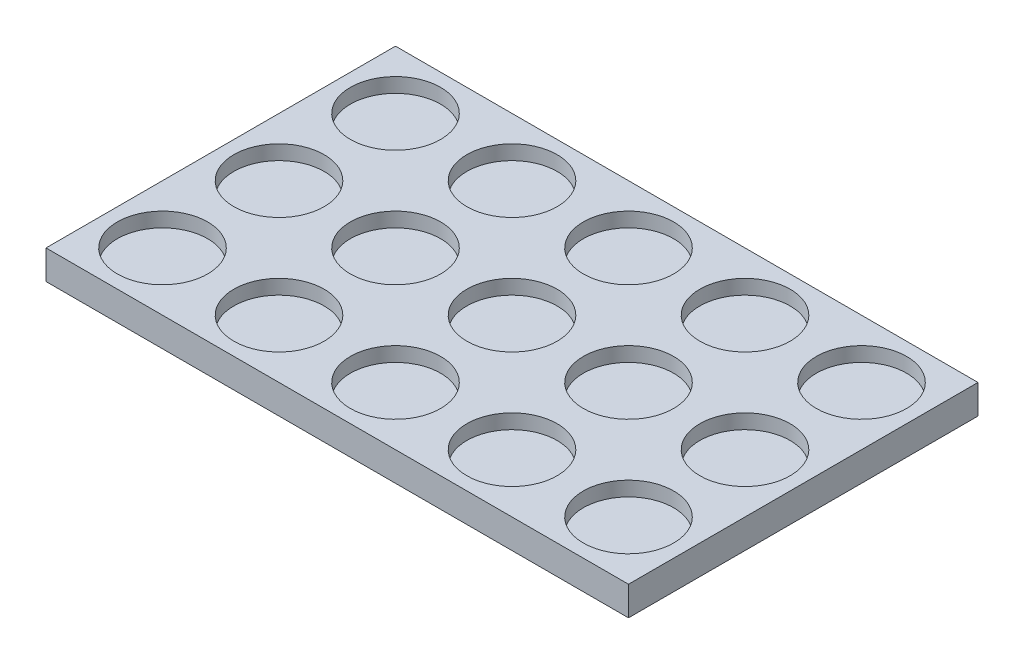
ISO-10303-21;
HEADER;
FILE_DESCRIPTION(('STEP AP214'),'2;1');
FILE_NAME('part.step','',(''),(''),'','','');
FILE_SCHEMA(('AUTOMOTIVE_DESIGN { 1 0 10303 214 1 1 1 1 }'));
ENDSEC;
DATA;
#1=APPLICATION_CONTEXT('core data for automotive mechanical design processes');
#2=APPLICATION_PROTOCOL_DEFINITION('international standard','automotive_design',2000,#1);
#3=PRODUCT_CONTEXT('',#1,'mechanical');
#4=PRODUCT('Part','Part','',(#3));
#5=PRODUCT_RELATED_PRODUCT_CATEGORY('part','',(#4));
#6=PRODUCT_DEFINITION_FORMATION('','',#4);
#7=PRODUCT_DEFINITION_CONTEXT('part definition',#1,'design');
#8=PRODUCT_DEFINITION('design','',#6,#7);
#9=PRODUCT_DEFINITION_SHAPE('','',#8);
#10=(LENGTH_UNIT() NAMED_UNIT(*) SI_UNIT(.MILLI.,.METRE.));
#11=(NAMED_UNIT(*) PLANE_ANGLE_UNIT() SI_UNIT($,.RADIAN.));
#12=(NAMED_UNIT(*) SI_UNIT($,.STERADIAN.) SOLID_ANGLE_UNIT());
#13=UNCERTAINTY_MEASURE_WITH_UNIT(LENGTH_MEASURE(1.E-05),#10,'distance_accuracy_value','');
#14=(GEOMETRIC_REPRESENTATION_CONTEXT(3) GLOBAL_UNCERTAINTY_ASSIGNED_CONTEXT((#13)) GLOBAL_UNIT_ASSIGNED_CONTEXT((#10,
#11,#12)) REPRESENTATION_CONTEXT('',''));
#15=CARTESIAN_POINT('',(0.,0.,0.));
#16=DIRECTION('',(0.,0.,1.));
#17=DIRECTION('',(1.,0.,0.));
#18=AXIS2_PLACEMENT_3D('',#15,#16,#17);
#19=CARTESIAN_POINT('',(-254.,25.4,-152.4));
#20=DIRECTION('',(1.,0.,0.));
#21=DIRECTION('',(0.,0.,-1.));
#22=AXIS2_PLACEMENT_3D('',#19,#20,#21);
#23=PLANE('',#22);
#24=DIRECTION('',(0.,0.,1.));
#25=VECTOR('',#24,1.);
#26=CARTESIAN_POINT('',(-254.,0.,-152.4));
#27=LINE('',#26,#25);
#28=CARTESIAN_POINT('',(-254.,0.,-152.4));
#29=VERTEX_POINT('',#28);
#30=CARTESIAN_POINT('',(-254.,0.,152.4));
#31=VERTEX_POINT('',#30);
#32=EDGE_CURVE('E101',#29,#31,#27,.T.);
#33=ORIENTED_EDGE('',*,*,#32,.T.);
#34=DIRECTION('',(0.,-1.,0.));
#35=VECTOR('',#34,1.);
#36=CARTESIAN_POINT('',(-254.,25.4,152.4));
#37=LINE('',#36,#35);
#38=CARTESIAN_POINT('',(-254.,25.4,152.4));
#39=VERTEX_POINT('',#38);
#40=EDGE_CURVE('E92',#39,#31,#37,.T.);
#41=ORIENTED_EDGE('',*,*,#40,.F.);
#42=DIRECTION('',(0.,0.,1.));
#43=VECTOR('',#42,1.);
#44=CARTESIAN_POINT('',(-254.,25.4,-152.4));
#45=LINE('',#44,#43);
#46=CARTESIAN_POINT('',(-254.,25.4,-152.4));
#47=VERTEX_POINT('',#46);
#48=EDGE_CURVE('E86',#47,#39,#45,.T.);
#49=ORIENTED_EDGE('',*,*,#48,.F.);
#50=DIRECTION('',(0.,-1.,0.));
#51=VECTOR('',#50,1.);
#52=CARTESIAN_POINT('',(-254.,25.4,-152.4));
#53=LINE('',#52,#51);
#54=EDGE_CURVE('E97',#47,#29,#53,.T.);
#55=ORIENTED_EDGE('',*,*,#54,.T.);
#56=EDGE_LOOP('',(#33,#41,#49,#55));
#57=FACE_BOUND('',#56,.T.);
#58=ADVANCED_FACE('F32',(#57),#23,.F.);
#59=CARTESIAN_POINT('',(-254.,25.4,152.4));
#60=DIRECTION('',(0.,0.,-1.));
#61=DIRECTION('',(-1.,0.,0.));
#62=AXIS2_PLACEMENT_3D('',#59,#60,#61);
#63=PLANE('',#62);
#64=DIRECTION('',(1.,0.,0.));
#65=VECTOR('',#64,1.);
#66=CARTESIAN_POINT('',(-254.,0.,152.4));
#67=LINE('',#66,#65);
#68=CARTESIAN_POINT('',(254.,0.,152.4));
#69=VERTEX_POINT('',#68);
#70=EDGE_CURVE('E91',#31,#69,#67,.T.);
#71=ORIENTED_EDGE('',*,*,#70,.T.);
#72=DIRECTION('',(0.,-1.,0.));
#73=VECTOR('',#72,1.);
#74=CARTESIAN_POINT('',(254.,25.4,152.4));
#75=LINE('',#74,#73);
#76=CARTESIAN_POINT('',(254.,25.4,152.4));
#77=VERTEX_POINT('',#76);
#78=EDGE_CURVE('E89',#77,#69,#75,.T.);
#79=ORIENTED_EDGE('',*,*,#78,.F.);
#80=DIRECTION('',(1.,0.,0.));
#81=VECTOR('',#80,1.);
#82=CARTESIAN_POINT('',(-254.,25.4,152.4));
#83=LINE('',#82,#81);
#84=EDGE_CURVE('E80',#39,#77,#83,.T.);
#85=ORIENTED_EDGE('',*,*,#84,.F.);
#86=ORIENTED_EDGE('',*,*,#40,.T.);
#87=EDGE_LOOP('',(#71,#79,#85,#86));
#88=FACE_BOUND('',#87,.T.);
#89=ADVANCED_FACE('F90',(#88),#63,.F.);
#90=CARTESIAN_POINT('',(254.,25.4,-152.4));
#91=DIRECTION('',(-1.,0.,0.));
#92=DIRECTION('',(0.,0.,1.));
#93=AXIS2_PLACEMENT_3D('',#90,#91,#92);
#94=PLANE('',#93);
#95=DIRECTION('',(0.,0.,-1.));
#96=VECTOR('',#95,1.);
#97=CARTESIAN_POINT('',(254.,0.,-152.4));
#98=LINE('',#97,#96);
#99=CARTESIAN_POINT('',(254.,0.,-152.4));
#100=VERTEX_POINT('',#99);
#101=EDGE_CURVE('E66',#69,#100,#98,.T.);
#102=ORIENTED_EDGE('',*,*,#101,.T.);
#103=DIRECTION('',(0.,-1.,0.));
#104=VECTOR('',#103,1.);
#105=CARTESIAN_POINT('',(254.,25.4,-152.4));
#106=LINE('',#105,#104);
#107=CARTESIAN_POINT('',(254.,25.4,-152.4));
#108=VERTEX_POINT('',#107);
#109=EDGE_CURVE('E93',#108,#100,#106,.T.);
#110=ORIENTED_EDGE('',*,*,#109,.F.);
#111=DIRECTION('',(0.,0.,-1.));
#112=VECTOR('',#111,1.);
#113=CARTESIAN_POINT('',(254.,25.4,-152.4));
#114=LINE('',#113,#112);
#115=EDGE_CURVE('E84',#77,#108,#114,.T.);
#116=ORIENTED_EDGE('',*,*,#115,.F.);
#117=ORIENTED_EDGE('',*,*,#78,.T.);
#118=EDGE_LOOP('',(#102,#110,#116,#117));
#119=FACE_BOUND('',#118,.T.);
#120=ADVANCED_FACE('F95',(#119),#94,.F.);
#121=CARTESIAN_POINT('',(-254.,25.4,-152.4));
#122=DIRECTION('',(0.,0.,1.));
#123=DIRECTION('',(1.,0.,0.));
#124=AXIS2_PLACEMENT_3D('',#121,#122,#123);
#125=PLANE('',#124);
#126=DIRECTION('',(-1.,0.,0.));
#127=VECTOR('',#126,1.);
#128=CARTESIAN_POINT('',(-254.,0.,-152.4));
#129=LINE('',#128,#127);
#130=EDGE_CURVE('E72',#100,#29,#129,.T.);
#131=ORIENTED_EDGE('',*,*,#130,.T.);
#132=ORIENTED_EDGE('',*,*,#54,.F.);
#133=DIRECTION('',(-1.,0.,0.));
#134=VECTOR('',#133,1.);
#135=CARTESIAN_POINT('',(-254.,25.4,-152.4));
#136=LINE('',#135,#134);
#137=EDGE_CURVE('E49',#108,#47,#136,.T.);
#138=ORIENTED_EDGE('',*,*,#137,.F.);
#139=ORIENTED_EDGE('',*,*,#109,.T.);
#140=EDGE_LOOP('',(#131,#132,#138,#139));
#141=FACE_BOUND('',#140,.T.);
#142=ADVANCED_FACE('F189',(#141),#125,.F.);
#143=CARTESIAN_POINT('',(0.,25.4,0.));
#144=DIRECTION('',(0.,1.,0.));
#145=DIRECTION('',(0.,0.,1.));
#146=AXIS2_PLACEMENT_3D('',#143,#144,#145);
#147=PLANE('',#146);
#148=CARTESIAN_POINT('',(-101.6,25.4,101.6));
#149=DIRECTION('',(0.,1.,0.));
#150=DIRECTION('',(0.,0.,1.));
#151=AXIS2_PLACEMENT_3D('',#148,#149,#150);
#152=CIRCLE('',#151,39.37);
#153=CARTESIAN_POINT('',(-101.6,25.4,140.97));
#154=VERTEX_POINT('',#153);
#155=EDGE_CURVE('E549',#154,#154,#152,.T.);
#156=ORIENTED_EDGE('',*,*,#155,.F.);
#157=EDGE_LOOP('',(#156));
#158=FACE_BOUND('',#157,.T.);
#159=CARTESIAN_POINT('',(-203.2,25.4,101.6));
#160=DIRECTION('',(0.,1.,0.));
#161=DIRECTION('',(0.,0.,1.));
#162=AXIS2_PLACEMENT_3D('',#159,#160,#161);
#163=CIRCLE('',#162,39.37);
#164=CARTESIAN_POINT('',(-203.2,25.4,140.97));
#165=VERTEX_POINT('',#164);
#166=EDGE_CURVE('E544',#165,#165,#163,.T.);
#167=ORIENTED_EDGE('',*,*,#166,.F.);
#168=EDGE_LOOP('',(#167));
#169=FACE_BOUND('',#168,.T.);
#170=ORIENTED_EDGE('',*,*,#48,.T.);
#171=ORIENTED_EDGE('',*,*,#84,.T.);
#172=ORIENTED_EDGE('',*,*,#115,.T.);
#173=ORIENTED_EDGE('',*,*,#137,.T.);
#174=EDGE_LOOP('',(#170,#171,#172,#173));
#175=FACE_BOUND('',#174,.T.);
#176=CARTESIAN_POINT('',(0.,25.4,101.6));
#177=DIRECTION('',(0.,1.,0.));
#178=DIRECTION('',(0.,0.,1.));
#179=AXIS2_PLACEMENT_3D('',#176,#177,#178);
#180=CIRCLE('',#179,39.37);
#181=CARTESIAN_POINT('',(0.,25.4,140.97));
#182=VERTEX_POINT('',#181);
#183=EDGE_CURVE('E111',#182,#182,#180,.T.);
#184=ORIENTED_EDGE('',*,*,#183,.F.);
#185=EDGE_LOOP('',(#184));
#186=FACE_BOUND('',#185,.T.);
#187=CARTESIAN_POINT('',(101.6,25.4,101.6));
#188=DIRECTION('',(0.,1.,0.));
#189=DIRECTION('',(0.,0.,1.));
#190=AXIS2_PLACEMENT_3D('',#187,#188,#189);
#191=CIRCLE('',#190,39.37);
#192=CARTESIAN_POINT('',(101.6,25.4,140.97));
#193=VERTEX_POINT('',#192);
#194=EDGE_CURVE('E117',#193,#193,#191,.T.);
#195=ORIENTED_EDGE('',*,*,#194,.F.);
#196=EDGE_LOOP('',(#195));
#197=FACE_BOUND('',#196,.T.);
#198=CARTESIAN_POINT('',(203.2,25.4,101.6));
#199=DIRECTION('',(0.,1.,0.));
#200=DIRECTION('',(0.,0.,1.));
#201=AXIS2_PLACEMENT_3D('',#198,#199,#200);
#202=CIRCLE('',#201,39.37);
#203=CARTESIAN_POINT('',(203.2,25.4,140.97));
#204=VERTEX_POINT('',#203);
#205=EDGE_CURVE('E123',#204,#204,#202,.T.);
#206=ORIENTED_EDGE('',*,*,#205,.F.);
#207=EDGE_LOOP('',(#206));
#208=FACE_BOUND('',#207,.T.);
#209=CARTESIAN_POINT('',(-203.2,25.4,0.));
#210=DIRECTION('',(0.,1.,0.));
#211=DIRECTION('',(0.,0.,1.));
#212=AXIS2_PLACEMENT_3D('',#209,#210,#211);
#213=CIRCLE('',#212,39.37);
#214=CARTESIAN_POINT('',(-203.2,25.4,39.3700000000001));
#215=VERTEX_POINT('',#214);
#216=EDGE_CURVE('E129',#215,#215,#213,.T.);
#217=ORIENTED_EDGE('',*,*,#216,.F.);
#218=EDGE_LOOP('',(#217));
#219=FACE_BOUND('',#218,.T.);
#220=CARTESIAN_POINT('',(-101.6,25.4,0.));
#221=DIRECTION('',(0.,1.,0.));
#222=DIRECTION('',(0.,0.,1.));
#223=AXIS2_PLACEMENT_3D('',#220,#221,#222);
#224=CIRCLE('',#223,39.37);
#225=CARTESIAN_POINT('',(-101.6,25.4,39.3700000000001));
#226=VERTEX_POINT('',#225);
#227=EDGE_CURVE('E135',#226,#226,#224,.T.);
#228=ORIENTED_EDGE('',*,*,#227,.F.);
#229=EDGE_LOOP('',(#228));
#230=FACE_BOUND('',#229,.T.);
#231=CARTESIAN_POINT('',(0.,25.4,0.));
#232=DIRECTION('',(0.,1.,0.));
#233=DIRECTION('',(0.,0.,1.));
#234=AXIS2_PLACEMENT_3D('',#231,#232,#233);
#235=CIRCLE('',#234,39.37);
#236=CARTESIAN_POINT('',(0.,25.4,39.3700000000001));
#237=VERTEX_POINT('',#236);
#238=EDGE_CURVE('E141',#237,#237,#235,.T.);
#239=ORIENTED_EDGE('',*,*,#238,.F.);
#240=EDGE_LOOP('',(#239));
#241=FACE_BOUND('',#240,.T.);
#242=CARTESIAN_POINT('',(101.6,25.4,0.));
#243=DIRECTION('',(0.,1.,0.));
#244=DIRECTION('',(0.,0.,1.));
#245=AXIS2_PLACEMENT_3D('',#242,#243,#244);
#246=CIRCLE('',#245,39.37);
#247=CARTESIAN_POINT('',(101.6,25.4,39.3700000000001));
#248=VERTEX_POINT('',#247);
#249=EDGE_CURVE('E147',#248,#248,#246,.T.);
#250=ORIENTED_EDGE('',*,*,#249,.F.);
#251=EDGE_LOOP('',(#250));
#252=FACE_BOUND('',#251,.T.);
#253=CARTESIAN_POINT('',(203.2,25.4,0.));
#254=DIRECTION('',(0.,1.,0.));
#255=DIRECTION('',(0.,0.,1.));
#256=AXIS2_PLACEMENT_3D('',#253,#254,#255);
#257=CIRCLE('',#256,39.37);
#258=CARTESIAN_POINT('',(203.2,25.4,39.3700000000001));
#259=VERTEX_POINT('',#258);
#260=EDGE_CURVE('E153',#259,#259,#257,.T.);
#261=ORIENTED_EDGE('',*,*,#260,.F.);
#262=EDGE_LOOP('',(#261));
#263=FACE_BOUND('',#262,.T.);
#264=CARTESIAN_POINT('',(-203.2,25.4,-101.6));
#265=DIRECTION('',(0.,1.,0.));
#266=DIRECTION('',(0.,0.,1.));
#267=AXIS2_PLACEMENT_3D('',#264,#265,#266);
#268=CIRCLE('',#267,39.37);
#269=CARTESIAN_POINT('',(-203.2,25.4,-62.2299999999999));
#270=VERTEX_POINT('',#269);
#271=EDGE_CURVE('E159',#270,#270,#268,.T.);
#272=ORIENTED_EDGE('',*,*,#271,.F.);
#273=EDGE_LOOP('',(#272));
#274=FACE_BOUND('',#273,.T.);
#275=CARTESIAN_POINT('',(-101.6,25.4,-101.6));
#276=DIRECTION('',(0.,1.,0.));
#277=DIRECTION('',(0.,0.,1.));
#278=AXIS2_PLACEMENT_3D('',#275,#276,#277);
#279=CIRCLE('',#278,39.37);
#280=CARTESIAN_POINT('',(-101.6,25.4,-62.2299999999999));
#281=VERTEX_POINT('',#280);
#282=EDGE_CURVE('E165',#281,#281,#279,.T.);
#283=ORIENTED_EDGE('',*,*,#282,.F.);
#284=EDGE_LOOP('',(#283));
#285=FACE_BOUND('',#284,.T.);
#286=CARTESIAN_POINT('',(0.,25.4,-101.6));
#287=DIRECTION('',(0.,1.,0.));
#288=DIRECTION('',(0.,0.,1.));
#289=AXIS2_PLACEMENT_3D('',#286,#287,#288);
#290=CIRCLE('',#289,39.37);
#291=CARTESIAN_POINT('',(0.,25.4,-62.2299999999999));
#292=VERTEX_POINT('',#291);
#293=EDGE_CURVE('E171',#292,#292,#290,.T.);
#294=ORIENTED_EDGE('',*,*,#293,.F.);
#295=EDGE_LOOP('',(#294));
#296=FACE_BOUND('',#295,.T.);
#297=CARTESIAN_POINT('',(101.6,25.4,-101.6));
#298=DIRECTION('',(0.,1.,0.));
#299=DIRECTION('',(0.,0.,1.));
#300=AXIS2_PLACEMENT_3D('',#297,#298,#299);
#301=CIRCLE('',#300,39.37);
#302=CARTESIAN_POINT('',(101.6,25.4,-62.2299999999999));
#303=VERTEX_POINT('',#302);
#304=EDGE_CURVE('E177',#303,#303,#301,.T.);
#305=ORIENTED_EDGE('',*,*,#304,.F.);
#306=EDGE_LOOP('',(#305));
#307=FACE_BOUND('',#306,.T.);
#308=CARTESIAN_POINT('',(203.2,25.4,-101.6));
#309=DIRECTION('',(0.,1.,0.));
#310=DIRECTION('',(0.,0.,1.));
#311=AXIS2_PLACEMENT_3D('',#308,#309,#310);
#312=CIRCLE('',#311,39.37);
#313=CARTESIAN_POINT('',(203.2,25.4,-62.2299999999999));
#314=VERTEX_POINT('',#313);
#315=EDGE_CURVE('E41',#314,#314,#312,.T.);
#316=ORIENTED_EDGE('',*,*,#315,.F.);
#317=EDGE_LOOP('',(#316));
#318=FACE_BOUND('',#317,.T.);
#319=ADVANCED_FACE('F81',(#158,#169,#175,#186,#197,#208,#219,#230,#241,#252,#263,#274,#285,#296,
#307,#318),#147,.T.);
#320=CARTESIAN_POINT('',(0.,0.,0.));
#321=DIRECTION('',(0.,1.,0.));
#322=DIRECTION('',(0.,0.,1.));
#323=AXIS2_PLACEMENT_3D('',#320,#321,#322);
#324=PLANE('',#323);
#325=ORIENTED_EDGE('',*,*,#32,.F.);
#326=ORIENTED_EDGE('',*,*,#130,.F.);
#327=ORIENTED_EDGE('',*,*,#101,.F.);
#328=ORIENTED_EDGE('',*,*,#70,.F.);
#329=EDGE_LOOP('',(#325,#326,#327,#328));
#330=FACE_BOUND('',#329,.T.);
#331=ADVANCED_FACE('F188',(#330),#324,.F.);
#332=CARTESIAN_POINT('',(-203.2,12.7,101.6));
#333=DIRECTION('',(0.,1.,0.));
#334=DIRECTION('',(0.,0.,1.));
#335=AXIS2_PLACEMENT_3D('',#332,#333,#334);
#336=CYLINDRICAL_SURFACE('',#335,39.37);
#337=CARTESIAN_POINT('',(-203.2,12.7,101.6));
#338=DIRECTION('',(0.,1.,0.));
#339=DIRECTION('',(0.,0.,1.));
#340=AXIS2_PLACEMENT_3D('',#337,#338,#339);
#341=CIRCLE('',#340,39.37);
#342=CARTESIAN_POINT('',(-203.2,12.7,140.97));
#343=VERTEX_POINT('',#342);
#344=EDGE_CURVE('E104',#343,#343,#341,.T.);
#345=ORIENTED_EDGE('',*,*,#344,.F.);
#346=EDGE_LOOP('',(#345));
#347=FACE_BOUND('',#346,.T.);
#348=ORIENTED_EDGE('',*,*,#166,.T.);
#349=EDGE_LOOP('',(#348));
#350=FACE_BOUND('',#349,.T.);
#351=ADVANCED_FACE('F196',(#347,#350),#336,.F.);
#352=CARTESIAN_POINT('',(-203.2,12.7,101.6));
#353=DIRECTION('',(0.,1.,0.));
#354=DIRECTION('',(0.,0.,1.));
#355=AXIS2_PLACEMENT_3D('',#352,#353,#354);
#356=PLANE('',#355);
#357=ORIENTED_EDGE('',*,*,#344,.T.);
#358=EDGE_LOOP('',(#357));
#359=FACE_BOUND('',#358,.T.);
#360=ADVANCED_FACE('F427',(#359),#356,.T.);
#361=CARTESIAN_POINT('',(-101.6,12.7,101.6));
#362=DIRECTION('',(0.,1.,0.));
#363=DIRECTION('',(0.,0.,1.));
#364=AXIS2_PLACEMENT_3D('',#361,#362,#363);
#365=CYLINDRICAL_SURFACE('',#364,39.37);
#366=CARTESIAN_POINT('',(-101.6,12.7,101.6));
#367=DIRECTION('',(0.,1.,0.));
#368=DIRECTION('',(0.,0.,1.));
#369=AXIS2_PLACEMENT_3D('',#366,#367,#368);
#370=CIRCLE('',#369,39.37);
#371=CARTESIAN_POINT('',(-101.6,12.7,140.97));
#372=VERTEX_POINT('',#371);
#373=EDGE_CURVE('E545',#372,#372,#370,.T.);
#374=ORIENTED_EDGE('',*,*,#373,.F.);
#375=EDGE_LOOP('',(#374));
#376=FACE_BOUND('',#375,.T.);
#377=ORIENTED_EDGE('',*,*,#155,.T.);
#378=EDGE_LOOP('',(#377));
#379=FACE_BOUND('',#378,.T.);
#380=ADVANCED_FACE('F419',(#376,#379),#365,.F.);
#381=CARTESIAN_POINT('',(-101.6,12.7,101.6));
#382=DIRECTION('',(0.,1.,0.));
#383=DIRECTION('',(0.,0.,1.));
#384=AXIS2_PLACEMENT_3D('',#381,#382,#383);
#385=PLANE('',#384);
#386=ORIENTED_EDGE('',*,*,#373,.T.);
#387=EDGE_LOOP('',(#386));
#388=FACE_BOUND('',#387,.T.);
#389=ADVANCED_FACE('F220',(#388),#385,.T.);
#390=CARTESIAN_POINT('',(0.,12.7,101.6));
#391=DIRECTION('',(0.,1.,0.));
#392=DIRECTION('',(0.,0.,1.));
#393=AXIS2_PLACEMENT_3D('',#390,#391,#392);
#394=PLANE('',#393);
#395=CARTESIAN_POINT('',(0.,12.7,101.6));
#396=DIRECTION('',(0.,1.,0.));
#397=DIRECTION('',(0.,0.,1.));
#398=AXIS2_PLACEMENT_3D('',#395,#396,#397);
#399=CIRCLE('',#398,39.37);
#400=CARTESIAN_POINT('',(0.,12.7,140.97));
#401=VERTEX_POINT('',#400);
#402=EDGE_CURVE('E114',#401,#401,#399,.T.);
#403=ORIENTED_EDGE('',*,*,#402,.T.);
#404=EDGE_LOOP('',(#403));
#405=FACE_BOUND('',#404,.T.);
#406=ADVANCED_FACE('F216',(#405),#394,.T.);
#407=CARTESIAN_POINT('',(0.,12.7,101.6));
#408=DIRECTION('',(0.,1.,0.));
#409=DIRECTION('',(0.,0.,1.));
#410=AXIS2_PLACEMENT_3D('',#407,#408,#409);
#411=CYLINDRICAL_SURFACE('',#410,39.37);
#412=ORIENTED_EDGE('',*,*,#402,.F.);
#413=EDGE_LOOP('',(#412));
#414=FACE_BOUND('',#413,.T.);
#415=ORIENTED_EDGE('',*,*,#183,.T.);
#416=EDGE_LOOP('',(#415));
#417=FACE_BOUND('',#416,.T.);
#418=ADVANCED_FACE('F212',(#414,#417),#411,.F.);
#419=CARTESIAN_POINT('',(101.6,12.7,101.6));
#420=DIRECTION('',(0.,1.,0.));
#421=DIRECTION('',(0.,0.,1.));
#422=AXIS2_PLACEMENT_3D('',#419,#420,#421);
#423=PLANE('',#422);
#424=CARTESIAN_POINT('',(101.6,12.7,101.6));
#425=DIRECTION('',(0.,1.,0.));
#426=DIRECTION('',(0.,0.,1.));
#427=AXIS2_PLACEMENT_3D('',#424,#425,#426);
#428=CIRCLE('',#427,39.37);
#429=CARTESIAN_POINT('',(101.6,12.7,140.97));
#430=VERTEX_POINT('',#429);
#431=EDGE_CURVE('E120',#430,#430,#428,.T.);
#432=ORIENTED_EDGE('',*,*,#431,.T.);
#433=EDGE_LOOP('',(#432));
#434=FACE_BOUND('',#433,.T.);
#435=ADVANCED_FACE('F215',(#434),#423,.T.);
#436=CARTESIAN_POINT('',(101.6,12.7,101.6));
#437=DIRECTION('',(0.,1.,0.));
#438=DIRECTION('',(0.,0.,1.));
#439=AXIS2_PLACEMENT_3D('',#436,#437,#438);
#440=CYLINDRICAL_SURFACE('',#439,39.37);
#441=ORIENTED_EDGE('',*,*,#431,.F.);
#442=EDGE_LOOP('',(#441));
#443=FACE_BOUND('',#442,.T.);
#444=ORIENTED_EDGE('',*,*,#194,.T.);
#445=EDGE_LOOP('',(#444));
#446=FACE_BOUND('',#445,.T.);
#447=ADVANCED_FACE('F222',(#443,#446),#440,.F.);
#448=CARTESIAN_POINT('',(203.2,12.7,101.6));
#449=DIRECTION('',(0.,1.,0.));
#450=DIRECTION('',(0.,0.,1.));
#451=AXIS2_PLACEMENT_3D('',#448,#449,#450);
#452=PLANE('',#451);
#453=CARTESIAN_POINT('',(203.2,12.7,101.6));
#454=DIRECTION('',(0.,1.,0.));
#455=DIRECTION('',(0.,0.,1.));
#456=AXIS2_PLACEMENT_3D('',#453,#454,#455);
#457=CIRCLE('',#456,39.37);
#458=CARTESIAN_POINT('',(203.2,12.7,140.97));
#459=VERTEX_POINT('',#458);
#460=EDGE_CURVE('E126',#459,#459,#457,.T.);
#461=ORIENTED_EDGE('',*,*,#460,.T.);
#462=EDGE_LOOP('',(#461));
#463=FACE_BOUND('',#462,.T.);
#464=ADVANCED_FACE('F225',(#463),#452,.T.);
#465=CARTESIAN_POINT('',(203.2,12.7,101.6));
#466=DIRECTION('',(0.,1.,0.));
#467=DIRECTION('',(0.,0.,1.));
#468=AXIS2_PLACEMENT_3D('',#465,#466,#467);
#469=CYLINDRICAL_SURFACE('',#468,39.37);
#470=ORIENTED_EDGE('',*,*,#460,.F.);
#471=EDGE_LOOP('',(#470));
#472=FACE_BOUND('',#471,.T.);
#473=ORIENTED_EDGE('',*,*,#205,.T.);
#474=EDGE_LOOP('',(#473));
#475=FACE_BOUND('',#474,.T.);
#476=ADVANCED_FACE('F230',(#472,#475),#469,.F.);
#477=CARTESIAN_POINT('',(-203.2,12.7,0.));
#478=DIRECTION('',(0.,1.,0.));
#479=DIRECTION('',(0.,0.,1.));
#480=AXIS2_PLACEMENT_3D('',#477,#478,#479);
#481=PLANE('',#480);
#482=CARTESIAN_POINT('',(-203.2,12.7,0.));
#483=DIRECTION('',(0.,1.,0.));
#484=DIRECTION('',(0.,0.,1.));
#485=AXIS2_PLACEMENT_3D('',#482,#483,#484);
#486=CIRCLE('',#485,39.37);
#487=CARTESIAN_POINT('',(-203.2,12.7,39.3700000000001));
#488=VERTEX_POINT('',#487);
#489=EDGE_CURVE('E132',#488,#488,#486,.T.);
#490=ORIENTED_EDGE('',*,*,#489,.T.);
#491=EDGE_LOOP('',(#490));
#492=FACE_BOUND('',#491,.T.);
#493=ADVANCED_FACE('F233',(#492),#481,.T.);
#494=CARTESIAN_POINT('',(-203.2,12.7,0.));
#495=DIRECTION('',(0.,1.,0.));
#496=DIRECTION('',(0.,0.,1.));
#497=AXIS2_PLACEMENT_3D('',#494,#495,#496);
#498=CYLINDRICAL_SURFACE('',#497,39.37);
#499=ORIENTED_EDGE('',*,*,#489,.F.);
#500=EDGE_LOOP('',(#499));
#501=FACE_BOUND('',#500,.T.);
#502=ORIENTED_EDGE('',*,*,#216,.T.);
#503=EDGE_LOOP('',(#502));
#504=FACE_BOUND('',#503,.T.);
#505=ADVANCED_FACE('F238',(#501,#504),#498,.F.);
#506=CARTESIAN_POINT('',(-101.6,12.7,0.));
#507=DIRECTION('',(0.,1.,0.));
#508=DIRECTION('',(0.,0.,1.));
#509=AXIS2_PLACEMENT_3D('',#506,#507,#508);
#510=PLANE('',#509);
#511=CARTESIAN_POINT('',(-101.6,12.7,0.));
#512=DIRECTION('',(0.,1.,0.));
#513=DIRECTION('',(0.,0.,1.));
#514=AXIS2_PLACEMENT_3D('',#511,#512,#513);
#515=CIRCLE('',#514,39.37);
#516=CARTESIAN_POINT('',(-101.6,12.7,39.3700000000001));
#517=VERTEX_POINT('',#516);
#518=EDGE_CURVE('E138',#517,#517,#515,.T.);
#519=ORIENTED_EDGE('',*,*,#518,.T.);
#520=EDGE_LOOP('',(#519));
#521=FACE_BOUND('',#520,.T.);
#522=ADVANCED_FACE('F241',(#521),#510,.T.);
#523=CARTESIAN_POINT('',(-101.6,12.7,0.));
#524=DIRECTION('',(0.,1.,0.));
#525=DIRECTION('',(0.,0.,1.));
#526=AXIS2_PLACEMENT_3D('',#523,#524,#525);
#527=CYLINDRICAL_SURFACE('',#526,39.37);
#528=ORIENTED_EDGE('',*,*,#518,.F.);
#529=EDGE_LOOP('',(#528));
#530=FACE_BOUND('',#529,.T.);
#531=ORIENTED_EDGE('',*,*,#227,.T.);
#532=EDGE_LOOP('',(#531));
#533=FACE_BOUND('',#532,.T.);
#534=ADVANCED_FACE('F246',(#530,#533),#527,.F.);
#535=CARTESIAN_POINT('',(0.,12.7,0.));
#536=DIRECTION('',(0.,1.,0.));
#537=DIRECTION('',(0.,0.,1.));
#538=AXIS2_PLACEMENT_3D('',#535,#536,#537);
#539=PLANE('',#538);
#540=CARTESIAN_POINT('',(0.,12.7,0.));
#541=DIRECTION('',(0.,1.,0.));
#542=DIRECTION('',(0.,0.,1.));
#543=AXIS2_PLACEMENT_3D('',#540,#541,#542);
#544=CIRCLE('',#543,39.37);
#545=CARTESIAN_POINT('',(0.,12.7,39.3700000000001));
#546=VERTEX_POINT('',#545);
#547=EDGE_CURVE('E144',#546,#546,#544,.T.);
#548=ORIENTED_EDGE('',*,*,#547,.T.);
#549=EDGE_LOOP('',(#548));
#550=FACE_BOUND('',#549,.T.);
#551=ADVANCED_FACE('F249',(#550),#539,.T.);
#552=CARTESIAN_POINT('',(0.,12.7,0.));
#553=DIRECTION('',(0.,1.,0.));
#554=DIRECTION('',(0.,0.,1.));
#555=AXIS2_PLACEMENT_3D('',#552,#553,#554);
#556=CYLINDRICAL_SURFACE('',#555,39.37);
#557=ORIENTED_EDGE('',*,*,#547,.F.);
#558=EDGE_LOOP('',(#557));
#559=FACE_BOUND('',#558,.T.);
#560=ORIENTED_EDGE('',*,*,#238,.T.);
#561=EDGE_LOOP('',(#560));
#562=FACE_BOUND('',#561,.T.);
#563=ADVANCED_FACE('F254',(#559,#562),#556,.F.);
#564=CARTESIAN_POINT('',(101.6,12.7,0.));
#565=DIRECTION('',(0.,1.,0.));
#566=DIRECTION('',(0.,0.,1.));
#567=AXIS2_PLACEMENT_3D('',#564,#565,#566);
#568=PLANE('',#567);
#569=CARTESIAN_POINT('',(101.6,12.7,0.));
#570=DIRECTION('',(0.,1.,0.));
#571=DIRECTION('',(0.,0.,1.));
#572=AXIS2_PLACEMENT_3D('',#569,#570,#571);
#573=CIRCLE('',#572,39.37);
#574=CARTESIAN_POINT('',(101.6,12.7,39.3700000000001));
#575=VERTEX_POINT('',#574);
#576=EDGE_CURVE('E150',#575,#575,#573,.T.);
#577=ORIENTED_EDGE('',*,*,#576,.T.);
#578=EDGE_LOOP('',(#577));
#579=FACE_BOUND('',#578,.T.);
#580=ADVANCED_FACE('F257',(#579),#568,.T.);
#581=CARTESIAN_POINT('',(101.6,12.7,0.));
#582=DIRECTION('',(0.,1.,0.));
#583=DIRECTION('',(0.,0.,1.));
#584=AXIS2_PLACEMENT_3D('',#581,#582,#583);
#585=CYLINDRICAL_SURFACE('',#584,39.37);
#586=ORIENTED_EDGE('',*,*,#576,.F.);
#587=EDGE_LOOP('',(#586));
#588=FACE_BOUND('',#587,.T.);
#589=ORIENTED_EDGE('',*,*,#249,.T.);
#590=EDGE_LOOP('',(#589));
#591=FACE_BOUND('',#590,.T.);
#592=ADVANCED_FACE('F262',(#588,#591),#585,.F.);
#593=CARTESIAN_POINT('',(203.2,12.7,0.));
#594=DIRECTION('',(0.,1.,0.));
#595=DIRECTION('',(0.,0.,1.));
#596=AXIS2_PLACEMENT_3D('',#593,#594,#595);
#597=PLANE('',#596);
#598=CARTESIAN_POINT('',(203.2,12.7,0.));
#599=DIRECTION('',(0.,1.,0.));
#600=DIRECTION('',(0.,0.,1.));
#601=AXIS2_PLACEMENT_3D('',#598,#599,#600);
#602=CIRCLE('',#601,39.37);
#603=CARTESIAN_POINT('',(203.2,12.7,39.3700000000001));
#604=VERTEX_POINT('',#603);
#605=EDGE_CURVE('E156',#604,#604,#602,.T.);
#606=ORIENTED_EDGE('',*,*,#605,.T.);
#607=EDGE_LOOP('',(#606));
#608=FACE_BOUND('',#607,.T.);
#609=ADVANCED_FACE('F265',(#608),#597,.T.);
#610=CARTESIAN_POINT('',(203.2,12.7,0.));
#611=DIRECTION('',(0.,1.,0.));
#612=DIRECTION('',(0.,0.,1.));
#613=AXIS2_PLACEMENT_3D('',#610,#611,#612);
#614=CYLINDRICAL_SURFACE('',#613,39.37);
#615=ORIENTED_EDGE('',*,*,#605,.F.);
#616=EDGE_LOOP('',(#615));
#617=FACE_BOUND('',#616,.T.);
#618=ORIENTED_EDGE('',*,*,#260,.T.);
#619=EDGE_LOOP('',(#618));
#620=FACE_BOUND('',#619,.T.);
#621=ADVANCED_FACE('F270',(#617,#620),#614,.F.);
#622=CARTESIAN_POINT('',(-203.2,12.7,-101.6));
#623=DIRECTION('',(0.,1.,0.));
#624=DIRECTION('',(0.,0.,1.));
#625=AXIS2_PLACEMENT_3D('',#622,#623,#624);
#626=PLANE('',#625);
#627=CARTESIAN_POINT('',(-203.2,12.7,-101.6));
#628=DIRECTION('',(0.,1.,0.));
#629=DIRECTION('',(0.,0.,1.));
#630=AXIS2_PLACEMENT_3D('',#627,#628,#629);
#631=CIRCLE('',#630,39.37);
#632=CARTESIAN_POINT('',(-203.2,12.7,-62.2299999999999));
#633=VERTEX_POINT('',#632);
#634=EDGE_CURVE('E162',#633,#633,#631,.T.);
#635=ORIENTED_EDGE('',*,*,#634,.T.);
#636=EDGE_LOOP('',(#635));
#637=FACE_BOUND('',#636,.T.);
#638=ADVANCED_FACE('F273',(#637),#626,.T.);
#639=CARTESIAN_POINT('',(-203.2,12.7,-101.6));
#640=DIRECTION('',(0.,1.,0.));
#641=DIRECTION('',(0.,0.,1.));
#642=AXIS2_PLACEMENT_3D('',#639,#640,#641);
#643=CYLINDRICAL_SURFACE('',#642,39.37);
#644=ORIENTED_EDGE('',*,*,#634,.F.);
#645=EDGE_LOOP('',(#644));
#646=FACE_BOUND('',#645,.T.);
#647=ORIENTED_EDGE('',*,*,#271,.T.);
#648=EDGE_LOOP('',(#647));
#649=FACE_BOUND('',#648,.T.);
#650=ADVANCED_FACE('F278',(#646,#649),#643,.F.);
#651=CARTESIAN_POINT('',(-101.6,12.7,-101.6));
#652=DIRECTION('',(0.,1.,0.));
#653=DIRECTION('',(0.,0.,1.));
#654=AXIS2_PLACEMENT_3D('',#651,#652,#653);
#655=PLANE('',#654);
#656=CARTESIAN_POINT('',(-101.6,12.7,-101.6));
#657=DIRECTION('',(0.,1.,0.));
#658=DIRECTION('',(0.,0.,1.));
#659=AXIS2_PLACEMENT_3D('',#656,#657,#658);
#660=CIRCLE('',#659,39.37);
#661=CARTESIAN_POINT('',(-101.6,12.7,-62.2299999999999));
#662=VERTEX_POINT('',#661);
#663=EDGE_CURVE('E168',#662,#662,#660,.T.);
#664=ORIENTED_EDGE('',*,*,#663,.T.);
#665=EDGE_LOOP('',(#664));
#666=FACE_BOUND('',#665,.T.);
#667=ADVANCED_FACE('F281',(#666),#655,.T.);
#668=CARTESIAN_POINT('',(-101.6,12.7,-101.6));
#669=DIRECTION('',(0.,1.,0.));
#670=DIRECTION('',(0.,0.,1.));
#671=AXIS2_PLACEMENT_3D('',#668,#669,#670);
#672=CYLINDRICAL_SURFACE('',#671,39.37);
#673=ORIENTED_EDGE('',*,*,#663,.F.);
#674=EDGE_LOOP('',(#673));
#675=FACE_BOUND('',#674,.T.);
#676=ORIENTED_EDGE('',*,*,#282,.T.);
#677=EDGE_LOOP('',(#676));
#678=FACE_BOUND('',#677,.T.);
#679=ADVANCED_FACE('F286',(#675,#678),#672,.F.);
#680=CARTESIAN_POINT('',(0.,12.7,-101.6));
#681=DIRECTION('',(0.,1.,0.));
#682=DIRECTION('',(0.,0.,1.));
#683=AXIS2_PLACEMENT_3D('',#680,#681,#682);
#684=PLANE('',#683);
#685=CARTESIAN_POINT('',(0.,12.7,-101.6));
#686=DIRECTION('',(0.,1.,0.));
#687=DIRECTION('',(0.,0.,1.));
#688=AXIS2_PLACEMENT_3D('',#685,#686,#687);
#689=CIRCLE('',#688,39.37);
#690=CARTESIAN_POINT('',(0.,12.7,-62.2299999999999));
#691=VERTEX_POINT('',#690);
#692=EDGE_CURVE('E174',#691,#691,#689,.T.);
#693=ORIENTED_EDGE('',*,*,#692,.T.);
#694=EDGE_LOOP('',(#693));
#695=FACE_BOUND('',#694,.T.);
#696=ADVANCED_FACE('F289',(#695),#684,.T.);
#697=CARTESIAN_POINT('',(0.,12.7,-101.6));
#698=DIRECTION('',(0.,1.,0.));
#699=DIRECTION('',(0.,0.,1.));
#700=AXIS2_PLACEMENT_3D('',#697,#698,#699);
#701=CYLINDRICAL_SURFACE('',#700,39.37);
#702=ORIENTED_EDGE('',*,*,#692,.F.);
#703=EDGE_LOOP('',(#702));
#704=FACE_BOUND('',#703,.T.);
#705=ORIENTED_EDGE('',*,*,#293,.T.);
#706=EDGE_LOOP('',(#705));
#707=FACE_BOUND('',#706,.T.);
#708=ADVANCED_FACE('F294',(#704,#707),#701,.F.);
#709=CARTESIAN_POINT('',(101.6,12.7,-101.6));
#710=DIRECTION('',(0.,1.,0.));
#711=DIRECTION('',(0.,0.,1.));
#712=AXIS2_PLACEMENT_3D('',#709,#710,#711);
#713=PLANE('',#712);
#714=CARTESIAN_POINT('',(101.6,12.7,-101.6));
#715=DIRECTION('',(0.,1.,0.));
#716=DIRECTION('',(0.,0.,1.));
#717=AXIS2_PLACEMENT_3D('',#714,#715,#716);
#718=CIRCLE('',#717,39.37);
#719=CARTESIAN_POINT('',(101.6,12.7,-62.2299999999999));
#720=VERTEX_POINT('',#719);
#721=EDGE_CURVE('E180',#720,#720,#718,.T.);
#722=ORIENTED_EDGE('',*,*,#721,.T.);
#723=EDGE_LOOP('',(#722));
#724=FACE_BOUND('',#723,.T.);
#725=ADVANCED_FACE('F297',(#724),#713,.T.);
#726=CARTESIAN_POINT('',(101.6,12.7,-101.6));
#727=DIRECTION('',(0.,1.,0.));
#728=DIRECTION('',(0.,0.,1.));
#729=AXIS2_PLACEMENT_3D('',#726,#727,#728);
#730=CYLINDRICAL_SURFACE('',#729,39.37);
#731=ORIENTED_EDGE('',*,*,#721,.F.);
#732=EDGE_LOOP('',(#731));
#733=FACE_BOUND('',#732,.T.);
#734=ORIENTED_EDGE('',*,*,#304,.T.);
#735=EDGE_LOOP('',(#734));
#736=FACE_BOUND('',#735,.T.);
#737=ADVANCED_FACE('F302',(#733,#736),#730,.F.);
#738=CARTESIAN_POINT('',(203.2,12.7,-101.6));
#739=DIRECTION('',(0.,1.,0.));
#740=DIRECTION('',(0.,0.,1.));
#741=AXIS2_PLACEMENT_3D('',#738,#739,#740);
#742=PLANE('',#741);
#743=CARTESIAN_POINT('',(203.2,12.7,-101.6));
#744=DIRECTION('',(0.,1.,0.));
#745=DIRECTION('',(0.,0.,1.));
#746=AXIS2_PLACEMENT_3D('',#743,#744,#745);
#747=CIRCLE('',#746,39.37);
#748=CARTESIAN_POINT('',(203.2,12.7,-62.2299999999999));
#749=VERTEX_POINT('',#748);
#750=EDGE_CURVE('E11',#749,#749,#747,.T.);
#751=ORIENTED_EDGE('',*,*,#750,.T.);
#752=EDGE_LOOP('',(#751));
#753=FACE_BOUND('',#752,.T.);
#754=ADVANCED_FACE('F34',(#753),#742,.T.);
#755=CARTESIAN_POINT('',(203.2,12.7,-101.6));
#756=DIRECTION('',(0.,1.,0.));
#757=DIRECTION('',(0.,0.,1.));
#758=AXIS2_PLACEMENT_3D('',#755,#756,#757);
#759=CYLINDRICAL_SURFACE('',#758,39.37);
#760=ORIENTED_EDGE('',*,*,#750,.F.);
#761=EDGE_LOOP('',(#760));
#762=FACE_BOUND('',#761,.T.);
#763=ORIENTED_EDGE('',*,*,#315,.T.);
#764=EDGE_LOOP('',(#763));
#765=FACE_BOUND('',#764,.T.);
#766=ADVANCED_FACE('F185',(#762,#765),#759,.F.);
#767=CLOSED_SHELL('',(#58,#89,#120,#142,#319,#331,#351,#360,#380,#389,#406,#418,#435,#447,#464,
#476,#493,#505,#522,#534,#551,#563,#580,#592,#609,#621,#638,#650,#667,#679,#696,#708,#725,#737,
#754,#766));
#768=MANIFOLD_SOLID_BREP('B2',#767);
#769=ADVANCED_BREP_SHAPE_REPRESENTATION('',(#18,#768),#14);
#770=SHAPE_DEFINITION_REPRESENTATION(#9,#769);
ENDSEC;
END-ISO-10303-21;
